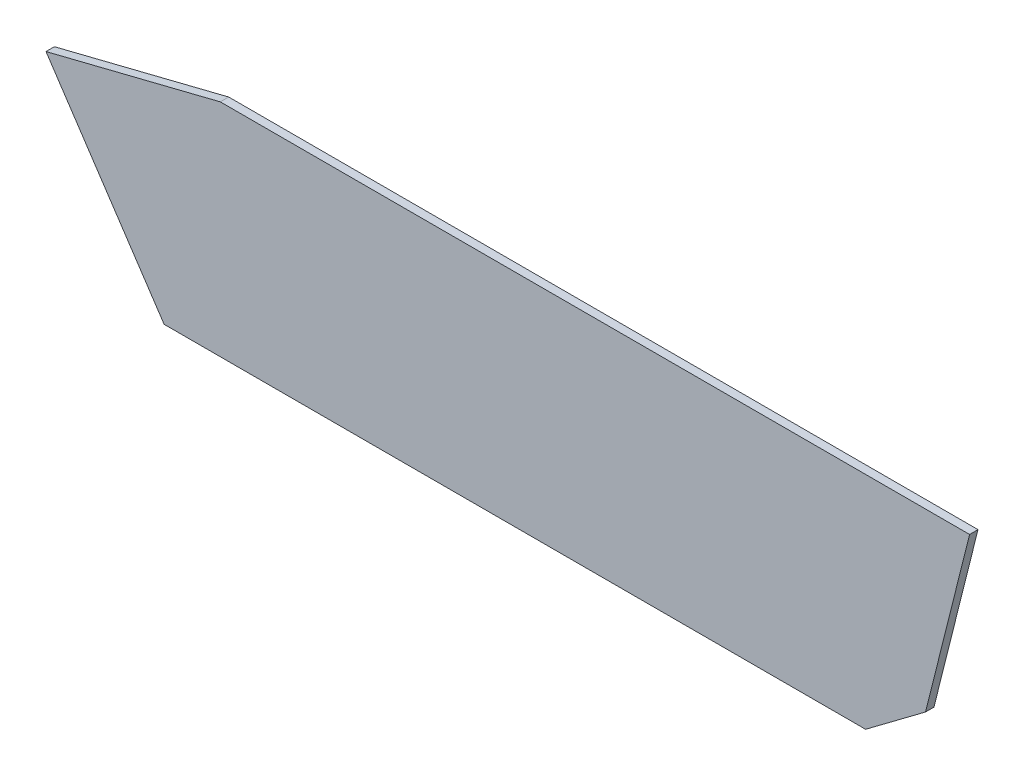
ISO-10303-21;
HEADER;
FILE_DESCRIPTION(('STEP AP214'),'2;1');
FILE_NAME('part.step','',(''),(''),'','','');
FILE_SCHEMA(('AUTOMOTIVE_DESIGN { 1 0 10303 214 1 1 1 1 }'));
ENDSEC;
DATA;
#1=APPLICATION_CONTEXT('core data for automotive mechanical design processes');
#2=APPLICATION_PROTOCOL_DEFINITION('international standard','automotive_design',2000,#1);
#3=PRODUCT_CONTEXT('',#1,'mechanical');
#4=PRODUCT('Part','Part','',(#3));
#5=PRODUCT_RELATED_PRODUCT_CATEGORY('part','',(#4));
#6=PRODUCT_DEFINITION_FORMATION('','',#4);
#7=PRODUCT_DEFINITION_CONTEXT('part definition',#1,'design');
#8=PRODUCT_DEFINITION('design','',#6,#7);
#9=PRODUCT_DEFINITION_SHAPE('','',#8);
#10=(LENGTH_UNIT() NAMED_UNIT(*) SI_UNIT(.MILLI.,.METRE.));
#11=(NAMED_UNIT(*) PLANE_ANGLE_UNIT() SI_UNIT($,.RADIAN.));
#12=(NAMED_UNIT(*) SI_UNIT($,.STERADIAN.) SOLID_ANGLE_UNIT());
#13=UNCERTAINTY_MEASURE_WITH_UNIT(LENGTH_MEASURE(1.E-05),#10,'distance_accuracy_value','');
#14=(GEOMETRIC_REPRESENTATION_CONTEXT(3) GLOBAL_UNCERTAINTY_ASSIGNED_CONTEXT((#13)) GLOBAL_UNIT_ASSIGNED_CONTEXT((#10,
#11,#12)) REPRESENTATION_CONTEXT('',''));
#15=CARTESIAN_POINT('',(0.,0.,0.));
#16=DIRECTION('',(0.,0.,1.));
#17=DIRECTION('',(1.,0.,0.));
#18=AXIS2_PLACEMENT_3D('',#15,#16,#17);
#19=CARTESIAN_POINT('',(425.,28.5708333333334,4.7625));
#20=DIRECTION('',(0.969981993554403,-0.243176750904001,0.));
#21=DIRECTION('',(0.243176750904001,0.969981993554403,0.));
#22=AXIS2_PLACEMENT_3D('',#19,#20,#21);
#23=PLANE('',#22);
#24=DIRECTION('',(-0.243176750904001,-0.969981993554403,0.));
#25=VECTOR('',#24,1.);
#26=CARTESIAN_POINT('',(425.,28.5708333333334,0.));
#27=LINE('',#26,#25);
#28=CARTESIAN_POINT('',(425.,28.5708333333334,0.));
#29=VERTEX_POINT('',#28);
#30=CARTESIAN_POINT('',(400.,-71.1490196078431,0.));
#31=VERTEX_POINT('',#30);
#32=EDGE_CURVE('E129',#29,#31,#27,.T.);
#33=ORIENTED_EDGE('',*,*,#32,.F.);
#34=DIRECTION('',(0.,0.,-1.));
#35=VECTOR('',#34,1.);
#36=CARTESIAN_POINT('',(425.,28.5708333333334,4.7625));
#37=LINE('',#36,#35);
#38=CARTESIAN_POINT('',(425.,28.5708333333334,4.7625));
#39=VERTEX_POINT('',#38);
#40=EDGE_CURVE('E11',#39,#29,#37,.T.);
#41=ORIENTED_EDGE('',*,*,#40,.F.);
#42=DIRECTION('',(-0.243176750904001,-0.969981993554403,0.));
#43=VECTOR('',#42,1.);
#44=CARTESIAN_POINT('',(425.,28.5708333333334,4.7625));
#45=LINE('',#44,#43);
#46=CARTESIAN_POINT('',(400.,-71.1490196078431,4.7625));
#47=VERTEX_POINT('',#46);
#48=EDGE_CURVE('E141',#39,#47,#45,.T.);
#49=ORIENTED_EDGE('',*,*,#48,.T.);
#50=DIRECTION('',(0.,0.,-1.));
#51=VECTOR('',#50,1.);
#52=CARTESIAN_POINT('',(400.,-71.1490196078431,4.7625));
#53=LINE('',#52,#51);
#54=EDGE_CURVE('E46',#47,#31,#53,.T.);
#55=ORIENTED_EDGE('',*,*,#54,.T.);
#56=EDGE_LOOP('',(#33,#41,#49,#55));
#57=FACE_BOUND('',#56,.T.);
#58=ADVANCED_FACE('F43',(#57),#23,.T.);
#59=CARTESIAN_POINT('',(425.,28.5708333333334,4.7625));
#60=DIRECTION('',(0.,-1.,0.));
#61=DIRECTION('',(1.,0.,0.));
#62=AXIS2_PLACEMENT_3D('',#59,#60,#61);
#63=PLANE('',#62);
#64=DIRECTION('',(-1.,0.,0.));
#65=VECTOR('',#64,1.);
#66=CARTESIAN_POINT('',(425.,28.5708333333334,0.));
#67=LINE('',#66,#65);
#68=CARTESIAN_POINT('',(0.,28.5708333333333,0.));
#69=VERTEX_POINT('',#68);
#70=EDGE_CURVE('E82',#29,#69,#67,.T.);
#71=ORIENTED_EDGE('',*,*,#70,.T.);
#72=DIRECTION('',(0.,0.,-1.));
#73=VECTOR('',#72,1.);
#74=CARTESIAN_POINT('',(0.,28.5708333333333,4.7625));
#75=LINE('',#74,#73);
#76=CARTESIAN_POINT('',(0.,28.5708333333333,4.7625));
#77=VERTEX_POINT('',#76);
#78=EDGE_CURVE('E52',#77,#69,#75,.T.);
#79=ORIENTED_EDGE('',*,*,#78,.F.);
#80=DIRECTION('',(-1.,0.,0.));
#81=VECTOR('',#80,1.);
#82=CARTESIAN_POINT('',(425.,28.5708333333334,4.7625));
#83=LINE('',#82,#81);
#84=EDGE_CURVE('E107',#39,#77,#83,.T.);
#85=ORIENTED_EDGE('',*,*,#84,.F.);
#86=ORIENTED_EDGE('',*,*,#40,.T.);
#87=EDGE_LOOP('',(#71,#79,#85,#86));
#88=FACE_BOUND('',#87,.T.);
#89=ADVANCED_FACE('F161',(#88),#63,.F.);
#90=CARTESIAN_POINT('',(0.,28.5708333333333,4.7625));
#91=DIRECTION('',(0.242535625036333,-0.970142500145332,0.));
#92=DIRECTION('',(0.970142500145332,0.242535625036333,0.));
#93=AXIS2_PLACEMENT_3D('',#90,#91,#92);
#94=PLANE('',#93);
#95=DIRECTION('',(-0.970142500145332,-0.242535625036333,0.));
#96=VECTOR('',#95,1.);
#97=CARTESIAN_POINT('',(0.,28.5708333333333,0.));
#98=LINE('',#97,#96);
#99=CARTESIAN_POINT('',(-98.8794117647059,3.85098039215685,0.));
#100=VERTEX_POINT('',#99);
#101=EDGE_CURVE('E114',#69,#100,#98,.T.);
#102=ORIENTED_EDGE('',*,*,#101,.T.);
#103=DIRECTION('',(0.,0.,-1.));
#104=VECTOR('',#103,1.);
#105=CARTESIAN_POINT('',(-98.8794117647059,3.85098039215685,4.7625));
#106=LINE('',#105,#104);
#107=CARTESIAN_POINT('',(-98.8794117647059,3.85098039215685,4.7625));
#108=VERTEX_POINT('',#107);
#109=EDGE_CURVE('E111',#108,#100,#106,.T.);
#110=ORIENTED_EDGE('',*,*,#109,.F.);
#111=DIRECTION('',(-0.970142500145332,-0.242535625036333,0.));
#112=VECTOR('',#111,1.);
#113=CARTESIAN_POINT('',(0.,28.5708333333333,4.7625));
#114=LINE('',#113,#112);
#115=EDGE_CURVE('E100',#77,#108,#114,.T.);
#116=ORIENTED_EDGE('',*,*,#115,.F.);
#117=ORIENTED_EDGE('',*,*,#78,.T.);
#118=EDGE_LOOP('',(#102,#110,#116,#117));
#119=FACE_BOUND('',#118,.T.);
#120=ADVANCED_FACE('F112',(#119),#94,.F.);
#121=CARTESIAN_POINT('',(-98.8794117647059,3.85098039215685,4.7625));
#122=DIRECTION('',(0.832050294337844,0.554700196225229,0.));
#123=DIRECTION('',(-0.554700196225229,0.832050294337844,0.));
#124=AXIS2_PLACEMENT_3D('',#121,#122,#123);
#125=PLANE('',#124);
#126=DIRECTION('',(0.554700196225229,-0.832050294337844,0.));
#127=VECTOR('',#126,1.);
#128=CARTESIAN_POINT('',(-98.8794117647059,3.85098039215685,0.));
#129=LINE('',#128,#127);
#130=CARTESIAN_POINT('',(-31.8794117647059,-96.6490196078432,0.));
#131=VERTEX_POINT('',#130);
#132=EDGE_CURVE('E138',#100,#131,#129,.T.);
#133=ORIENTED_EDGE('',*,*,#132,.T.);
#134=DIRECTION('',(0.,0.,-1.));
#135=VECTOR('',#134,1.);
#136=CARTESIAN_POINT('',(-31.8794117647059,-96.6490196078432,4.7625));
#137=LINE('',#136,#135);
#138=CARTESIAN_POINT('',(-31.8794117647059,-96.6490196078432,4.7625));
#139=VERTEX_POINT('',#138);
#140=EDGE_CURVE('E117',#139,#131,#137,.T.);
#141=ORIENTED_EDGE('',*,*,#140,.F.);
#142=DIRECTION('',(0.554700196225229,-0.832050294337844,0.));
#143=VECTOR('',#142,1.);
#144=CARTESIAN_POINT('',(-98.8794117647059,3.85098039215685,4.7625));
#145=LINE('',#144,#143);
#146=EDGE_CURVE('E105',#108,#139,#145,.T.);
#147=ORIENTED_EDGE('',*,*,#146,.F.);
#148=ORIENTED_EDGE('',*,*,#109,.T.);
#149=EDGE_LOOP('',(#133,#141,#147,#148));
#150=FACE_BOUND('',#149,.T.);
#151=ADVANCED_FACE('F119',(#150),#125,.F.);
#152=CARTESIAN_POINT('',(-31.8794117647059,-96.6490196078432,4.7625));
#153=DIRECTION('',(0.,1.,0.));
#154=DIRECTION('',(-1.,0.,0.));
#155=AXIS2_PLACEMENT_3D('',#152,#153,#154);
#156=PLANE('',#155);
#157=DIRECTION('',(1.,0.,0.));
#158=VECTOR('',#157,1.);
#159=CARTESIAN_POINT('',(-31.8794117647059,-96.6490196078432,0.));
#160=LINE('',#159,#158);
#161=CARTESIAN_POINT('',(366.,-96.6490196078432,0.));
#162=VERTEX_POINT('',#161);
#163=EDGE_CURVE('E135',#131,#162,#160,.T.);
#164=ORIENTED_EDGE('',*,*,#163,.T.);
#165=DIRECTION('',(0.,0.,-1.));
#166=VECTOR('',#165,1.);
#167=CARTESIAN_POINT('',(366.,-96.6490196078432,4.7625));
#168=LINE('',#167,#166);
#169=CARTESIAN_POINT('',(366.,-96.6490196078432,4.7625));
#170=VERTEX_POINT('',#169);
#171=EDGE_CURVE('E144',#170,#162,#168,.T.);
#172=ORIENTED_EDGE('',*,*,#171,.F.);
#173=DIRECTION('',(1.,0.,0.));
#174=VECTOR('',#173,1.);
#175=CARTESIAN_POINT('',(-31.8794117647059,-96.6490196078432,4.7625));
#176=LINE('',#175,#174);
#177=EDGE_CURVE('E122',#139,#170,#176,.T.);
#178=ORIENTED_EDGE('',*,*,#177,.F.);
#179=ORIENTED_EDGE('',*,*,#140,.T.);
#180=EDGE_LOOP('',(#164,#172,#178,#179));
#181=FACE_BOUND('',#180,.T.);
#182=ADVANCED_FACE('F151',(#181),#156,.F.);
#183=CARTESIAN_POINT('',(400.,-71.1490196078431,4.7625));
#184=DIRECTION('',(0.6,-0.8,0.));
#185=DIRECTION('',(0.8,0.6,0.));
#186=AXIS2_PLACEMENT_3D('',#183,#184,#185);
#187=PLANE('',#186);
#188=DIRECTION('',(-0.8,-0.6,0.));
#189=VECTOR('',#188,1.);
#190=CARTESIAN_POINT('',(400.,-71.1490196078431,0.));
#191=LINE('',#190,#189);
#192=EDGE_CURVE('E132',#31,#162,#191,.T.);
#193=ORIENTED_EDGE('',*,*,#192,.F.);
#194=ORIENTED_EDGE('',*,*,#54,.F.);
#195=DIRECTION('',(-0.8,-0.6,0.));
#196=VECTOR('',#195,1.);
#197=CARTESIAN_POINT('',(400.,-71.1490196078431,4.7625));
#198=LINE('',#197,#196);
#199=EDGE_CURVE('E124',#47,#170,#198,.T.);
#200=ORIENTED_EDGE('',*,*,#199,.T.);
#201=ORIENTED_EDGE('',*,*,#171,.T.);
#202=EDGE_LOOP('',(#193,#194,#200,#201));
#203=FACE_BOUND('',#202,.T.);
#204=ADVANCED_FACE('F146',(#203),#187,.T.);
#205=CARTESIAN_POINT('',(0.,0.,4.7625));
#206=DIRECTION('',(0.,0.,1.));
#207=DIRECTION('',(1.,0.,0.));
#208=AXIS2_PLACEMENT_3D('',#205,#206,#207);
#209=PLANE('',#208);
#210=ORIENTED_EDGE('',*,*,#48,.F.);
#211=ORIENTED_EDGE('',*,*,#84,.T.);
#212=ORIENTED_EDGE('',*,*,#115,.T.);
#213=ORIENTED_EDGE('',*,*,#146,.T.);
#214=ORIENTED_EDGE('',*,*,#177,.T.);
#215=ORIENTED_EDGE('',*,*,#199,.F.);
#216=EDGE_LOOP('',(#210,#211,#212,#213,#214,#215));
#217=FACE_BOUND('',#216,.T.);
#218=ADVANCED_FACE('F103',(#217),#209,.T.);
#219=CARTESIAN_POINT('',(0.,0.,0.));
#220=DIRECTION('',(0.,0.,1.));
#221=DIRECTION('',(1.,0.,0.));
#222=AXIS2_PLACEMENT_3D('',#219,#220,#221);
#223=PLANE('',#222);
#224=ORIENTED_EDGE('',*,*,#32,.T.);
#225=ORIENTED_EDGE('',*,*,#192,.T.);
#226=ORIENTED_EDGE('',*,*,#163,.F.);
#227=ORIENTED_EDGE('',*,*,#132,.F.);
#228=ORIENTED_EDGE('',*,*,#101,.F.);
#229=ORIENTED_EDGE('',*,*,#70,.F.);
#230=EDGE_LOOP('',(#224,#225,#226,#227,#228,#229));
#231=FACE_BOUND('',#230,.T.);
#232=ADVANCED_FACE('F149',(#231),#223,.F.);
#233=CLOSED_SHELL('',(#58,#89,#120,#151,#182,#204,#218,#232));
#234=MANIFOLD_SOLID_BREP('B2',#233);
#235=ADVANCED_BREP_SHAPE_REPRESENTATION('',(#18,#234),#14);
#236=SHAPE_DEFINITION_REPRESENTATION(#9,#235);
ENDSEC;
END-ISO-10303-21;
